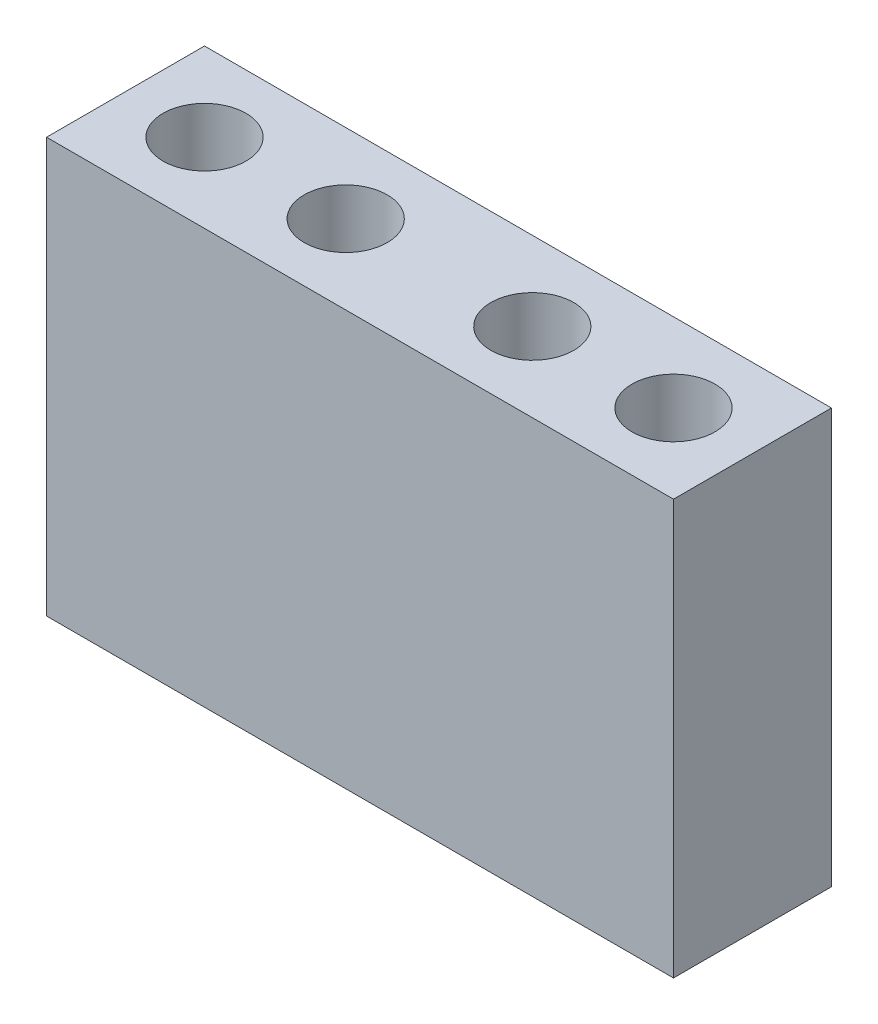
ISO-10303-21;
HEADER;
FILE_DESCRIPTION(('STEP AP214'),'2;1');
FILE_NAME('part.step','',(''),(''),'','','');
FILE_SCHEMA(('AUTOMOTIVE_DESIGN { 1 0 10303 214 1 1 1 1 }'));
ENDSEC;
DATA;
#1=APPLICATION_CONTEXT('core data for automotive mechanical design processes');
#2=APPLICATION_PROTOCOL_DEFINITION('international standard','automotive_design',2000,#1);
#3=PRODUCT_CONTEXT('',#1,'mechanical');
#4=PRODUCT('Part','Part','',(#3));
#5=PRODUCT_RELATED_PRODUCT_CATEGORY('part','',(#4));
#6=PRODUCT_DEFINITION_FORMATION('','',#4);
#7=PRODUCT_DEFINITION_CONTEXT('part definition',#1,'design');
#8=PRODUCT_DEFINITION('design','',#6,#7);
#9=PRODUCT_DEFINITION_SHAPE('','',#8);
#10=(LENGTH_UNIT() NAMED_UNIT(*) SI_UNIT(.MILLI.,.METRE.));
#11=(NAMED_UNIT(*) PLANE_ANGLE_UNIT() SI_UNIT($,.RADIAN.));
#12=(NAMED_UNIT(*) SI_UNIT($,.STERADIAN.) SOLID_ANGLE_UNIT());
#13=UNCERTAINTY_MEASURE_WITH_UNIT(LENGTH_MEASURE(1.E-05),#10,'distance_accuracy_value','');
#14=(GEOMETRIC_REPRESENTATION_CONTEXT(3) GLOBAL_UNCERTAINTY_ASSIGNED_CONTEXT((#13)) GLOBAL_UNIT_ASSIGNED_CONTEXT((#10,
#11,#12)) REPRESENTATION_CONTEXT('',''));
#15=CARTESIAN_POINT('',(0.,0.,0.));
#16=DIRECTION('',(0.,0.,1.));
#17=DIRECTION('',(1.,0.,0.));
#18=AXIS2_PLACEMENT_3D('',#15,#16,#17);
#19=CARTESIAN_POINT('',(-17.9,4.,0.));
#20=DIRECTION('',(1.,0.,0.));
#21=DIRECTION('',(0.,0.,-1.));
#22=AXIS2_PLACEMENT_3D('',#19,#20,#21);
#23=CYLINDRICAL_SURFACE('',#22,2.1);
#24=CARTESIAN_POINT('',(18.6,4.,0.));
#25=DIRECTION('',(1.,0.,0.));
#26=DIRECTION('',(0.,0.,-1.));
#27=AXIS2_PLACEMENT_3D('',#24,#25,#26);
#28=CIRCLE('',#27,2.1);
#29=CARTESIAN_POINT('',(18.6,6.,0.640312423743278));
#30=VERTEX_POINT('',#29);
#31=CARTESIAN_POINT('',(18.6,2.,0.640312423743294));
#32=VERTEX_POINT('',#31);
#33=EDGE_CURVE('E187',#30,#32,#28,.T.);
#34=ORIENTED_EDGE('',*,*,#33,.T.);
#35=CARTESIAN_POINT('',(16.6,4.,0.));
#36=DIRECTION('',(-0.707106781186548,-0.707106781186547,0.));
#37=DIRECTION('',(0.707106781186548,-0.707106781186547,0.));
#38=AXIS2_PLACEMENT_3D('',#35,#36,#37);
#39=ELLIPSE('',#38,2.9698484809835,2.1);
#40=CARTESIAN_POINT('',(16.6,4.,2.1));
#41=VERTEX_POINT('',#40);
#42=EDGE_CURVE('E161',#32,#41,#39,.T.);
#43=ORIENTED_EDGE('',*,*,#42,.T.);
#44=CARTESIAN_POINT('',(16.6,4.,0.));
#45=DIRECTION('',(0.707106781186548,-0.707106781186547,0.));
#46=DIRECTION('',(-0.707106781186548,-0.707106781186547,0.));
#47=AXIS2_PLACEMENT_3D('',#44,#45,#46);
#48=ELLIPSE('',#47,2.9698484809835,2.1);
#49=EDGE_CURVE('E188',#41,#30,#48,.F.);
#50=ORIENTED_EDGE('',*,*,#49,.T.);
#51=EDGE_LOOP('',(#34,#43,#50));
#52=FACE_BOUND('',#51,.T.);
#53=ADVANCED_FACE('F39',(#52),#23,.F.);
#54=CARTESIAN_POINT('',(18.6,2.,-0.640312423743287));
#55=VERTEX_POINT('',#54);
#56=CARTESIAN_POINT('',(18.6,6.,-0.640312423743279));
#57=VERTEX_POINT('',#56);
#58=EDGE_CURVE('E55',#55,#57,#28,.T.);
#59=ORIENTED_EDGE('',*,*,#58,.T.);
#60=CARTESIAN_POINT('',(16.6,4.,-2.1));
#61=VERTEX_POINT('',#60);
#62=EDGE_CURVE('E240',#57,#61,#48,.F.);
#63=ORIENTED_EDGE('',*,*,#62,.T.);
#64=EDGE_CURVE('E171',#61,#55,#39,.T.);
#65=ORIENTED_EDGE('',*,*,#64,.T.);
#66=EDGE_LOOP('',(#59,#63,#65));
#67=FACE_BOUND('',#66,.T.);
#68=ADVANCED_FACE('F451',(#67),#23,.F.);
#69=CARTESIAN_POINT('',(16.6,2.,0.));
#70=DIRECTION('',(0.,-1.,0.));
#71=DIRECTION('',(0.,0.,-1.));
#72=AXIS2_PLACEMENT_3D('',#69,#70,#71);
#73=PLANE('',#72);
#74=DIRECTION('',(0.,0.,1.));
#75=VECTOR('',#74,1.);
#76=CARTESIAN_POINT('',(18.6,2.,0.));
#77=LINE('',#76,#75);
#78=EDGE_CURVE('E178',#55,#32,#77,.T.);
#79=ORIENTED_EDGE('',*,*,#78,.F.);
#80=CARTESIAN_POINT('',(16.6,2.,0.));
#81=DIRECTION('',(0.,-1.,0.));
#82=DIRECTION('',(0.,0.,-1.));
#83=AXIS2_PLACEMENT_3D('',#80,#81,#82);
#84=CIRCLE('',#83,2.1);
#85=CARTESIAN_POINT('',(14.6,2.,-0.640312423743288));
#86=VERTEX_POINT('',#85);
#87=EDGE_CURVE('E185',#86,#55,#84,.T.);
#88=ORIENTED_EDGE('',*,*,#87,.F.);
#89=CARTESIAN_POINT('',(14.6,2.,0.640312423743283));
#90=VERTEX_POINT('',#89);
#91=EDGE_CURVE('E181',#90,#86,#84,.T.);
#92=ORIENTED_EDGE('',*,*,#91,.F.);
#93=EDGE_CURVE('E164',#32,#90,#84,.T.);
#94=ORIENTED_EDGE('',*,*,#93,.F.);
#95=EDGE_LOOP('',(#79,#88,#92,#94));
#96=FACE_BOUND('',#95,.T.);
#97=ADVANCED_FACE('F176',(#96),#73,.F.);
#98=CARTESIAN_POINT('',(16.6,21.,0.));
#99=DIRECTION('',(0.,-1.,0.));
#100=DIRECTION('',(0.,0.,-1.));
#101=AXIS2_PLACEMENT_3D('',#98,#99,#100);
#102=CYLINDRICAL_SURFACE('',#101,2.1);
#103=ORIENTED_EDGE('',*,*,#42,.F.);
#104=ORIENTED_EDGE('',*,*,#93,.T.);
#105=CARTESIAN_POINT('',(16.6,4.,0.));
#106=DIRECTION('',(0.707106781186548,-0.707106781186547,0.));
#107=DIRECTION('',(-0.707106781186548,-0.707106781186547,0.));
#108=AXIS2_PLACEMENT_3D('',#105,#106,#107);
#109=ELLIPSE('',#108,2.9698484809835,2.1);
#110=EDGE_CURVE('E166',#41,#90,#109,.T.);
#111=ORIENTED_EDGE('',*,*,#110,.F.);
#112=EDGE_LOOP('',(#103,#104,#111));
#113=FACE_BOUND('',#112,.T.);
#114=ADVANCED_FACE('F163',(#113),#102,.F.);
#115=EDGE_CURVE('E237',#86,#61,#109,.T.);
#116=ORIENTED_EDGE('',*,*,#115,.F.);
#117=ORIENTED_EDGE('',*,*,#87,.T.);
#118=ORIENTED_EDGE('',*,*,#64,.F.);
#119=EDGE_LOOP('',(#116,#117,#118));
#120=FACE_BOUND('',#119,.T.);
#121=ADVANCED_FACE('F511',(#120),#102,.F.);
#122=CARTESIAN_POINT('',(9.45,21.,0.));
#123=DIRECTION('',(0.,-1.,0.));
#124=DIRECTION('',(0.,0.,-1.));
#125=AXIS2_PLACEMENT_3D('',#122,#123,#124);
#126=CYLINDRICAL_SURFACE('',#125,2.1);
#127=CARTESIAN_POINT('',(9.45,4.,0.));
#128=DIRECTION('',(-0.707106781186548,-0.707106781186547,0.));
#129=DIRECTION('',(0.707106781186548,-0.707106781186547,0.));
#130=AXIS2_PLACEMENT_3D('',#127,#128,#129);
#131=ELLIPSE('',#130,2.9698484809835,2.1);
#132=CARTESIAN_POINT('',(11.45,2.,0.640312423743282));
#133=VERTEX_POINT('',#132);
#134=CARTESIAN_POINT('',(9.45,4.,2.1));
#135=VERTEX_POINT('',#134);
#136=EDGE_CURVE('E347',#133,#135,#131,.T.);
#137=ORIENTED_EDGE('',*,*,#136,.F.);
#138=CARTESIAN_POINT('',(9.45,2.,0.));
#139=DIRECTION('',(0.,-1.,0.));
#140=DIRECTION('',(0.,0.,-1.));
#141=AXIS2_PLACEMENT_3D('',#138,#139,#140);
#142=CIRCLE('',#141,2.1);
#143=CARTESIAN_POINT('',(7.45,2.,0.64031242374328));
#144=VERTEX_POINT('',#143);
#145=EDGE_CURVE('E211',#133,#144,#142,.T.);
#146=ORIENTED_EDGE('',*,*,#145,.T.);
#147=CARTESIAN_POINT('',(9.45,4.,0.));
#148=DIRECTION('',(0.707106781186548,-0.707106781186547,0.));
#149=DIRECTION('',(-0.707106781186548,-0.707106781186547,0.));
#150=AXIS2_PLACEMENT_3D('',#147,#148,#149);
#151=ELLIPSE('',#150,2.9698484809835,2.1);
#152=EDGE_CURVE('E48',#135,#144,#151,.T.);
#153=ORIENTED_EDGE('',*,*,#152,.F.);
#154=EDGE_LOOP('',(#137,#146,#153));
#155=FACE_BOUND('',#154,.T.);
#156=ADVANCED_FACE('F385',(#155),#126,.F.);
#157=CARTESIAN_POINT('',(7.45,2.,-0.640312423743292));
#158=VERTEX_POINT('',#157);
#159=CARTESIAN_POINT('',(9.45,4.,-2.1));
#160=VERTEX_POINT('',#159);
#161=EDGE_CURVE('E351',#158,#160,#151,.T.);
#162=ORIENTED_EDGE('',*,*,#161,.F.);
#163=CARTESIAN_POINT('',(11.45,2.,-0.64031242374329));
#164=VERTEX_POINT('',#163);
#165=EDGE_CURVE('E206',#158,#164,#142,.T.);
#166=ORIENTED_EDGE('',*,*,#165,.T.);
#167=EDGE_CURVE('E348',#160,#164,#131,.T.);
#168=ORIENTED_EDGE('',*,*,#167,.F.);
#169=EDGE_LOOP('',(#162,#166,#168));
#170=FACE_BOUND('',#169,.T.);
#171=ADVANCED_FACE('F372',(#170),#126,.F.);
#172=CARTESIAN_POINT('',(0.,21.,0.));
#173=DIRECTION('',(0.,-1.,0.));
#174=DIRECTION('',(0.,0.,-1.));
#175=AXIS2_PLACEMENT_3D('',#172,#173,#174);
#176=CYLINDRICAL_SURFACE('',#175,2.1);
#177=CARTESIAN_POINT('',(0.,4.,0.));
#178=DIRECTION('',(-0.707106781186548,-0.707106781186547,0.));
#179=DIRECTION('',(0.707106781186548,-0.707106781186547,0.));
#180=AXIS2_PLACEMENT_3D('',#177,#178,#179);
#181=ELLIPSE('',#180,2.9698484809835,2.1);
#182=CARTESIAN_POINT('',(2.,2.,0.640312423743278));
#183=VERTEX_POINT('',#182);
#184=CARTESIAN_POINT('',(0.,4.,2.1));
#185=VERTEX_POINT('',#184);
#186=EDGE_CURVE('E266',#183,#185,#181,.T.);
#187=ORIENTED_EDGE('',*,*,#186,.F.);
#188=CARTESIAN_POINT('',(0.,2.,0.));
#189=DIRECTION('',(0.,-1.,0.));
#190=DIRECTION('',(0.,0.,-1.));
#191=AXIS2_PLACEMENT_3D('',#188,#189,#190);
#192=CIRCLE('',#191,2.1);
#193=CARTESIAN_POINT('',(-2.,2.,0.640312423743276));
#194=VERTEX_POINT('',#193);
#195=EDGE_CURVE('E221',#183,#194,#192,.T.);
#196=ORIENTED_EDGE('',*,*,#195,.T.);
#197=CARTESIAN_POINT('',(0.,4.,0.));
#198=DIRECTION('',(0.707106781186548,-0.707106781186547,0.));
#199=DIRECTION('',(-0.707106781186548,-0.707106781186547,0.));
#200=AXIS2_PLACEMENT_3D('',#197,#198,#199);
#201=ELLIPSE('',#200,2.9698484809835,2.1);
#202=EDGE_CURVE('E272',#185,#194,#201,.T.);
#203=ORIENTED_EDGE('',*,*,#202,.F.);
#204=EDGE_LOOP('',(#187,#196,#203));
#205=FACE_BOUND('',#204,.T.);
#206=ADVANCED_FACE('F432',(#205),#176,.F.);
#207=CARTESIAN_POINT('',(-2.,2.,-0.640312423743296));
#208=VERTEX_POINT('',#207);
#209=CARTESIAN_POINT('',(0.,4.,-2.1));
#210=VERTEX_POINT('',#209);
#211=EDGE_CURVE('E271',#208,#210,#201,.T.);
#212=ORIENTED_EDGE('',*,*,#211,.F.);
#213=CARTESIAN_POINT('',(2.,2.,-0.640312423743294));
#214=VERTEX_POINT('',#213);
#215=EDGE_CURVE('E215',#208,#214,#192,.T.);
#216=ORIENTED_EDGE('',*,*,#215,.T.);
#217=EDGE_CURVE('E267',#210,#214,#181,.T.);
#218=ORIENTED_EDGE('',*,*,#217,.F.);
#219=EDGE_LOOP('',(#212,#216,#218));
#220=FACE_BOUND('',#219,.T.);
#221=ADVANCED_FACE('F419',(#220),#176,.F.);
#222=CARTESIAN_POINT('',(-7.15,21.,0.));
#223=DIRECTION('',(0.,-1.,0.));
#224=DIRECTION('',(0.,0.,-1.));
#225=AXIS2_PLACEMENT_3D('',#222,#223,#224);
#226=CYLINDRICAL_SURFACE('',#225,2.1);
#227=CARTESIAN_POINT('',(-7.15,4.,0.));
#228=DIRECTION('',(-0.707106781186548,-0.707106781186547,0.));
#229=DIRECTION('',(0.707106781186548,-0.707106781186547,0.));
#230=AXIS2_PLACEMENT_3D('',#227,#228,#229);
#231=ELLIPSE('',#230,2.9698484809835,2.1);
#232=CARTESIAN_POINT('',(-5.15,2.,0.640312423743275));
#233=VERTEX_POINT('',#232);
#234=CARTESIAN_POINT('',(-7.15,4.,2.09999999999999));
#235=VERTEX_POINT('',#234);
#236=EDGE_CURVE('E247',#233,#235,#231,.T.);
#237=ORIENTED_EDGE('',*,*,#236,.F.);
#238=CARTESIAN_POINT('',(-7.15,2.,0.));
#239=DIRECTION('',(0.,-1.,0.));
#240=DIRECTION('',(0.,0.,-1.));
#241=AXIS2_PLACEMENT_3D('',#238,#239,#240);
#242=CIRCLE('',#241,2.1);
#243=CARTESIAN_POINT('',(-9.15000000000001,2.,0.640312423743273));
#244=VERTEX_POINT('',#243);
#245=EDGE_CURVE('E230',#233,#244,#242,.T.);
#246=ORIENTED_EDGE('',*,*,#245,.T.);
#247=CARTESIAN_POINT('',(-7.15,4.,0.));
#248=DIRECTION('',(0.707106781186548,-0.707106781186547,0.));
#249=DIRECTION('',(-0.707106781186548,-0.707106781186547,0.));
#250=AXIS2_PLACEMENT_3D('',#247,#248,#249);
#251=ELLIPSE('',#250,2.9698484809835,2.1);
#252=EDGE_CURVE('E254',#235,#244,#251,.T.);
#253=ORIENTED_EDGE('',*,*,#252,.F.);
#254=EDGE_LOOP('',(#237,#246,#253));
#255=FACE_BOUND('',#254,.T.);
#256=ADVANCED_FACE('F521',(#255),#226,.F.);
#257=CARTESIAN_POINT('',(-9.15,2.,-0.640312423743299));
#258=VERTEX_POINT('',#257);
#259=CARTESIAN_POINT('',(-7.15,4.,-2.10000000000001));
#260=VERTEX_POINT('',#259);
#261=EDGE_CURVE('E252',#258,#260,#251,.T.);
#262=ORIENTED_EDGE('',*,*,#261,.F.);
#263=CARTESIAN_POINT('',(-5.15,2.,-0.640312423743297));
#264=VERTEX_POINT('',#263);
#265=EDGE_CURVE('E225',#258,#264,#242,.T.);
#266=ORIENTED_EDGE('',*,*,#265,.T.);
#267=EDGE_CURVE('E248',#260,#264,#231,.T.);
#268=ORIENTED_EDGE('',*,*,#267,.F.);
#269=EDGE_LOOP('',(#262,#266,#268));
#270=FACE_BOUND('',#269,.T.);
#271=ADVANCED_FACE('F524',(#270),#226,.F.);
#272=CARTESIAN_POINT('',(0.,4.,0.));
#273=DIRECTION('',(0.707106781186548,-0.707106781186547,0.));
#274=DIRECTION('',(-0.707106781186548,-0.707106781186547,0.));
#275=AXIS2_PLACEMENT_3D('',#272,#273,#274);
#276=ELLIPSE('',#275,2.9698484809835,2.1);
#277=EDGE_CURVE('E276',#185,#210,#276,.F.);
#278=ORIENTED_EDGE('',*,*,#277,.F.);
#279=CARTESIAN_POINT('',(0.,4.,0.));
#280=DIRECTION('',(-0.707106781186548,-0.707106781186547,0.));
#281=DIRECTION('',(0.707106781186548,-0.707106781186547,0.));
#282=AXIS2_PLACEMENT_3D('',#279,#280,#281);
#283=ELLIPSE('',#282,2.9698484809835,2.1);
#284=EDGE_CURVE('E262',#210,#185,#283,.F.);
#285=ORIENTED_EDGE('',*,*,#284,.F.);
#286=EDGE_LOOP('',(#278,#285));
#287=FACE_BOUND('',#286,.T.);
#288=CARTESIAN_POINT('',(0.,21.,0.));
#289=DIRECTION('',(0.,1.,0.));
#290=DIRECTION('',(0.,0.,1.));
#291=AXIS2_PLACEMENT_3D('',#288,#289,#290);
#292=CIRCLE('',#291,2.1);
#293=CARTESIAN_POINT('',(0.,21.,2.1));
#294=VERTEX_POINT('',#293);
#295=EDGE_CURVE('E297',#294,#294,#292,.T.);
#296=ORIENTED_EDGE('',*,*,#295,.T.);
#297=EDGE_LOOP('',(#296));
#298=FACE_BOUND('',#297,.T.);
#299=ADVANCED_FACE('F429',(#287,#298),#176,.F.);
#300=CARTESIAN_POINT('',(-7.15,4.,0.));
#301=DIRECTION('',(0.707106781186548,-0.707106781186547,0.));
#302=DIRECTION('',(-0.707106781186548,-0.707106781186547,0.));
#303=AXIS2_PLACEMENT_3D('',#300,#301,#302);
#304=ELLIPSE('',#303,2.9698484809835,2.1);
#305=EDGE_CURVE('E258',#235,#260,#304,.F.);
#306=ORIENTED_EDGE('',*,*,#305,.F.);
#307=CARTESIAN_POINT('',(-7.15,4.,0.));
#308=DIRECTION('',(-0.707106781186548,-0.707106781186547,0.));
#309=DIRECTION('',(0.707106781186548,-0.707106781186547,0.));
#310=AXIS2_PLACEMENT_3D('',#307,#308,#309);
#311=ELLIPSE('',#310,2.9698484809835,2.1);
#312=EDGE_CURVE('E243',#260,#235,#311,.F.);
#313=ORIENTED_EDGE('',*,*,#312,.F.);
#314=EDGE_LOOP('',(#306,#313));
#315=FACE_BOUND('',#314,.T.);
#316=CARTESIAN_POINT('',(-7.15,21.,0.));
#317=DIRECTION('',(0.,1.,0.));
#318=DIRECTION('',(0.,0.,1.));
#319=AXIS2_PLACEMENT_3D('',#316,#317,#318);
#320=CIRCLE('',#319,2.1);
#321=CARTESIAN_POINT('',(-7.15,21.,2.1));
#322=VERTEX_POINT('',#321);
#323=EDGE_CURVE('E293',#322,#322,#320,.T.);
#324=ORIENTED_EDGE('',*,*,#323,.T.);
#325=EDGE_LOOP('',(#324));
#326=FACE_BOUND('',#325,.T.);
#327=ADVANCED_FACE('F509',(#315,#326),#226,.F.);
#328=ORIENTED_EDGE('',*,*,#49,.F.);
#329=CARTESIAN_POINT('',(16.6,4.,0.));
#330=DIRECTION('',(-0.707106781186548,-0.707106781186547,0.));
#331=DIRECTION('',(0.707106781186548,-0.707106781186547,0.));
#332=AXIS2_PLACEMENT_3D('',#329,#330,#331);
#333=ELLIPSE('',#332,2.9698484809835,2.1);
#334=EDGE_CURVE('E172',#61,#41,#333,.F.);
#335=ORIENTED_EDGE('',*,*,#334,.F.);
#336=ORIENTED_EDGE('',*,*,#62,.F.);
#337=CARTESIAN_POINT('',(16.6,4.,0.));
#338=DIRECTION('',(0.707106781186548,-0.707106781186547,0.));
#339=DIRECTION('',(-0.707106781186548,-0.707106781186547,0.));
#340=AXIS2_PLACEMENT_3D('',#337,#338,#339);
#341=ELLIPSE('',#340,2.9698484809835,2.1);
#342=EDGE_CURVE('E62',#30,#57,#341,.F.);
#343=ORIENTED_EDGE('',*,*,#342,.F.);
#344=EDGE_LOOP('',(#328,#335,#336,#343));
#345=FACE_BOUND('',#344,.T.);
#346=CARTESIAN_POINT('',(16.6,21.,0.));
#347=DIRECTION('',(0.,1.,0.));
#348=DIRECTION('',(0.,0.,1.));
#349=AXIS2_PLACEMENT_3D('',#346,#347,#348);
#350=CIRCLE('',#349,2.1);
#351=CARTESIAN_POINT('',(16.6,21.,2.1));
#352=VERTEX_POINT('',#351);
#353=EDGE_CURVE('E289',#352,#352,#350,.T.);
#354=ORIENTED_EDGE('',*,*,#353,.T.);
#355=EDGE_LOOP('',(#354));
#356=FACE_BOUND('',#355,.T.);
#357=ADVANCED_FACE('F505',(#345,#356),#102,.F.);
#358=CARTESIAN_POINT('',(9.45,4.,0.));
#359=DIRECTION('',(0.707106781186548,-0.707106781186547,0.));
#360=DIRECTION('',(-0.707106781186548,-0.707106781186547,0.));
#361=AXIS2_PLACEMENT_3D('',#358,#359,#360);
#362=ELLIPSE('',#361,2.9698484809835,2.1);
#363=EDGE_CURVE('E11',#135,#160,#362,.F.);
#364=ORIENTED_EDGE('',*,*,#363,.F.);
#365=CARTESIAN_POINT('',(9.45,4.,0.));
#366=DIRECTION('',(-0.707106781186548,-0.707106781186547,0.));
#367=DIRECTION('',(0.707106781186548,-0.707106781186547,0.));
#368=AXIS2_PLACEMENT_3D('',#365,#366,#367);
#369=ELLIPSE('',#368,2.9698484809835,2.1);
#370=EDGE_CURVE('E343',#160,#135,#369,.F.);
#371=ORIENTED_EDGE('',*,*,#370,.F.);
#372=EDGE_LOOP('',(#364,#371));
#373=FACE_BOUND('',#372,.T.);
#374=CARTESIAN_POINT('',(9.45,21.,0.));
#375=DIRECTION('',(0.,1.,0.));
#376=DIRECTION('',(0.,0.,1.));
#377=AXIS2_PLACEMENT_3D('',#374,#375,#376);
#378=CIRCLE('',#377,2.1);
#379=CARTESIAN_POINT('',(9.45,21.,2.1));
#380=VERTEX_POINT('',#379);
#381=EDGE_CURVE('E285',#380,#380,#378,.T.);
#382=ORIENTED_EDGE('',*,*,#381,.T.);
#383=EDGE_LOOP('',(#382));
#384=FACE_BOUND('',#383,.T.);
#385=ADVANCED_FACE('F366',(#373,#384),#126,.F.);
#386=CARTESIAN_POINT('',(0.,21.,0.));
#387=DIRECTION('',(0.,1.,0.));
#388=DIRECTION('',(0.,0.,1.));
#389=AXIS2_PLACEMENT_3D('',#386,#387,#388);
#390=PLANE('',#389);
#391=ORIENTED_EDGE('',*,*,#353,.F.);
#392=EDGE_LOOP('',(#391));
#393=FACE_BOUND('',#392,.T.);
#394=ORIENTED_EDGE('',*,*,#295,.F.);
#395=EDGE_LOOP('',(#394));
#396=FACE_BOUND('',#395,.T.);
#397=DIRECTION('',(0.,0.,1.));
#398=VECTOR('',#397,1.);
#399=CARTESIAN_POINT('',(-11.15,21.,-4.));
#400=LINE('',#399,#398);
#401=CARTESIAN_POINT('',(-11.15,21.,-4.));
#402=VERTEX_POINT('',#401);
#403=CARTESIAN_POINT('',(-11.15,21.,4.));
#404=VERTEX_POINT('',#403);
#405=EDGE_CURVE('E302',#402,#404,#400,.T.);
#406=ORIENTED_EDGE('',*,*,#405,.T.);
#407=DIRECTION('',(1.,0.,0.));
#408=VECTOR('',#407,1.);
#409=CARTESIAN_POINT('',(-11.15,21.,4.));
#410=LINE('',#409,#408);
#411=CARTESIAN_POINT('',(20.6,21.,4.));
#412=VERTEX_POINT('',#411);
#413=EDGE_CURVE('E306',#404,#412,#410,.T.);
#414=ORIENTED_EDGE('',*,*,#413,.T.);
#415=DIRECTION('',(0.,0.,-1.));
#416=VECTOR('',#415,1.);
#417=CARTESIAN_POINT('',(20.6,21.,-4.));
#418=LINE('',#417,#416);
#419=CARTESIAN_POINT('',(20.6,21.,-4.));
#420=VERTEX_POINT('',#419);
#421=EDGE_CURVE('E310',#412,#420,#418,.T.);
#422=ORIENTED_EDGE('',*,*,#421,.T.);
#423=DIRECTION('',(-1.,0.,0.));
#424=VECTOR('',#423,1.);
#425=CARTESIAN_POINT('',(-11.15,21.,-4.));
#426=LINE('',#425,#424);
#427=EDGE_CURVE('E313',#420,#402,#426,.T.);
#428=ORIENTED_EDGE('',*,*,#427,.T.);
#429=EDGE_LOOP('',(#406,#414,#422,#428));
#430=FACE_BOUND('',#429,.T.);
#431=ORIENTED_EDGE('',*,*,#323,.F.);
#432=EDGE_LOOP('',(#431));
#433=FACE_BOUND('',#432,.T.);
#434=ORIENTED_EDGE('',*,*,#381,.F.);
#435=EDGE_LOOP('',(#434));
#436=FACE_BOUND('',#435,.T.);
#437=ADVANCED_FACE('F497',(#393,#396,#430,#433,#436),#390,.T.);
#438=CARTESIAN_POINT('',(0.,0.,0.));
#439=DIRECTION('',(0.,1.,0.));
#440=DIRECTION('',(0.,0.,1.));
#441=AXIS2_PLACEMENT_3D('',#438,#439,#440);
#442=PLANE('',#441);
#443=DIRECTION('',(0.,0.,1.));
#444=VECTOR('',#443,1.);
#445=CARTESIAN_POINT('',(-11.15,0.,-4.));
#446=LINE('',#445,#444);
#447=CARTESIAN_POINT('',(-11.15,0.,-4.));
#448=VERTEX_POINT('',#447);
#449=CARTESIAN_POINT('',(-11.15,0.,4.));
#450=VERTEX_POINT('',#449);
#451=EDGE_CURVE('E301',#448,#450,#446,.T.);
#452=ORIENTED_EDGE('',*,*,#451,.F.);
#453=DIRECTION('',(-1.,0.,0.));
#454=VECTOR('',#453,1.);
#455=CARTESIAN_POINT('',(-11.15,0.,-4.));
#456=LINE('',#455,#454);
#457=CARTESIAN_POINT('',(20.6,0.,-4.));
#458=VERTEX_POINT('',#457);
#459=EDGE_CURVE('E307',#458,#448,#456,.T.);
#460=ORIENTED_EDGE('',*,*,#459,.F.);
#461=DIRECTION('',(0.,0.,-1.));
#462=VECTOR('',#461,1.);
#463=CARTESIAN_POINT('',(20.6,0.,-4.));
#464=LINE('',#463,#462);
#465=CARTESIAN_POINT('',(20.6,0.,4.));
#466=VERTEX_POINT('',#465);
#467=EDGE_CURVE('E323',#466,#458,#464,.T.);
#468=ORIENTED_EDGE('',*,*,#467,.F.);
#469=DIRECTION('',(1.,0.,0.));
#470=VECTOR('',#469,1.);
#471=CARTESIAN_POINT('',(-11.15,0.,4.));
#472=LINE('',#471,#470);
#473=EDGE_CURVE('E320',#450,#466,#472,.T.);
#474=ORIENTED_EDGE('',*,*,#473,.F.);
#475=EDGE_LOOP('',(#452,#460,#468,#474));
#476=FACE_BOUND('',#475,.T.);
#477=ADVANCED_FACE('F476',(#476),#442,.F.);
#478=CARTESIAN_POINT('',(-11.15,21.,-4.));
#479=DIRECTION('',(1.,0.,0.));
#480=DIRECTION('',(0.,0.,-1.));
#481=AXIS2_PLACEMENT_3D('',#478,#479,#480);
#482=PLANE('',#481);
#483=CARTESIAN_POINT('',(-11.15,4.,0.));
#484=DIRECTION('',(1.,0.,0.));
#485=DIRECTION('',(0.,0.,-1.));
#486=AXIS2_PLACEMENT_3D('',#483,#484,#485);
#487=CIRCLE('',#486,2.1);
#488=CARTESIAN_POINT('',(-11.15,4.,-2.10000000000001));
#489=VERTEX_POINT('',#488);
#490=EDGE_CURVE('E281',#489,#489,#487,.T.);
#491=ORIENTED_EDGE('',*,*,#490,.T.);
#492=EDGE_LOOP('',(#491));
#493=FACE_BOUND('',#492,.T.);
#494=ORIENTED_EDGE('',*,*,#451,.T.);
#495=DIRECTION('',(0.,-1.,0.));
#496=VECTOR('',#495,1.);
#497=CARTESIAN_POINT('',(-11.15,21.,4.));
#498=LINE('',#497,#496);
#499=EDGE_CURVE('E339',#404,#450,#498,.T.);
#500=ORIENTED_EDGE('',*,*,#499,.F.);
#501=ORIENTED_EDGE('',*,*,#405,.F.);
#502=DIRECTION('',(0.,-1.,0.));
#503=VECTOR('',#502,1.);
#504=CARTESIAN_POINT('',(-11.15,21.,-4.));
#505=LINE('',#504,#503);
#506=EDGE_CURVE('E316',#402,#448,#505,.T.);
#507=ORIENTED_EDGE('',*,*,#506,.T.);
#508=EDGE_LOOP('',(#494,#500,#501,#507));
#509=FACE_BOUND('',#508,.T.);
#510=ADVANCED_FACE('F41',(#493,#509),#482,.F.);
#511=CARTESIAN_POINT('',(-11.15,21.,4.));
#512=DIRECTION('',(0.,0.,-1.));
#513=DIRECTION('',(-1.,0.,0.));
#514=AXIS2_PLACEMENT_3D('',#511,#512,#513);
#515=PLANE('',#514);
#516=ORIENTED_EDGE('',*,*,#473,.T.);
#517=DIRECTION('',(0.,-1.,0.));
#518=VECTOR('',#517,1.);
#519=CARTESIAN_POINT('',(20.6,21.,4.));
#520=LINE('',#519,#518);
#521=EDGE_CURVE('E335',#412,#466,#520,.T.);
#522=ORIENTED_EDGE('',*,*,#521,.F.);
#523=ORIENTED_EDGE('',*,*,#413,.F.);
#524=ORIENTED_EDGE('',*,*,#499,.T.);
#525=EDGE_LOOP('',(#516,#522,#523,#524));
#526=FACE_BOUND('',#525,.T.);
#527=ADVANCED_FACE('F472',(#526),#515,.F.);
#528=CARTESIAN_POINT('',(20.6,21.,-4.));
#529=DIRECTION('',(-1.,0.,0.));
#530=DIRECTION('',(0.,0.,1.));
#531=AXIS2_PLACEMENT_3D('',#528,#529,#530);
#532=PLANE('',#531);
#533=ORIENTED_EDGE('',*,*,#467,.T.);
#534=DIRECTION('',(0.,-1.,0.));
#535=VECTOR('',#534,1.);
#536=CARTESIAN_POINT('',(20.6,21.,-4.));
#537=LINE('',#536,#535);
#538=EDGE_CURVE('E331',#420,#458,#537,.T.);
#539=ORIENTED_EDGE('',*,*,#538,.F.);
#540=ORIENTED_EDGE('',*,*,#421,.F.);
#541=ORIENTED_EDGE('',*,*,#521,.T.);
#542=EDGE_LOOP('',(#533,#539,#540,#541));
#543=FACE_BOUND('',#542,.T.);
#544=ADVANCED_FACE('F466',(#543),#532,.F.);
#545=CARTESIAN_POINT('',(-11.15,21.,-4.));
#546=DIRECTION('',(0.,0.,1.));
#547=DIRECTION('',(1.,0.,0.));
#548=AXIS2_PLACEMENT_3D('',#545,#546,#547);
#549=PLANE('',#548);
#550=ORIENTED_EDGE('',*,*,#459,.T.);
#551=ORIENTED_EDGE('',*,*,#506,.F.);
#552=ORIENTED_EDGE('',*,*,#427,.F.);
#553=ORIENTED_EDGE('',*,*,#538,.T.);
#554=EDGE_LOOP('',(#550,#551,#552,#553));
#555=FACE_BOUND('',#554,.T.);
#556=ADVANCED_FACE('F460',(#555),#549,.F.);
#557=ORIENTED_EDGE('',*,*,#277,.T.);
#558=ORIENTED_EDGE('',*,*,#217,.T.);
#559=CARTESIAN_POINT('',(0.,4.,0.));
#560=DIRECTION('',(0.707106781186547,0.707106781186547,0.));
#561=DIRECTION('',(0.707106781186547,-0.707106781186547,0.));
#562=AXIS2_PLACEMENT_3D('',#559,#560,#561);
#563=ELLIPSE('',#562,2.9698484809835,2.1);
#564=EDGE_CURVE('E220',#214,#183,#563,.F.);
#565=ORIENTED_EDGE('',*,*,#564,.T.);
#566=ORIENTED_EDGE('',*,*,#186,.T.);
#567=EDGE_LOOP('',(#557,#558,#565,#566));
#568=FACE_BOUND('',#567,.T.);
#569=ORIENTED_EDGE('',*,*,#152,.T.);
#570=CARTESIAN_POINT('',(9.45,4.,0.));
#571=DIRECTION('',(0.707106781186547,-0.707106781186547,0.));
#572=DIRECTION('',(0.707106781186547,0.707106781186547,0.));
#573=AXIS2_PLACEMENT_3D('',#570,#571,#572);
#574=ELLIPSE('',#573,2.9698484809835,2.1);
#575=EDGE_CURVE('E210',#144,#158,#574,.T.);
#576=ORIENTED_EDGE('',*,*,#575,.T.);
#577=ORIENTED_EDGE('',*,*,#161,.T.);
#578=ORIENTED_EDGE('',*,*,#370,.T.);
#579=EDGE_LOOP('',(#569,#576,#577,#578));
#580=FACE_BOUND('',#579,.T.);
#581=ADVANCED_FACE('F360',(#568,#580),#23,.F.);
#582=ORIENTED_EDGE('',*,*,#110,.T.);
#583=CARTESIAN_POINT('',(16.6,4.,0.));
#584=DIRECTION('',(0.707106781186547,-0.707106781186547,0.));
#585=DIRECTION('',(0.707106781186547,0.707106781186547,0.));
#586=AXIS2_PLACEMENT_3D('',#583,#584,#585);
#587=ELLIPSE('',#586,2.9698484809835,2.1);
#588=EDGE_CURVE('E183',#90,#86,#587,.T.);
#589=ORIENTED_EDGE('',*,*,#588,.T.);
#590=ORIENTED_EDGE('',*,*,#115,.T.);
#591=ORIENTED_EDGE('',*,*,#334,.T.);
#592=EDGE_LOOP('',(#582,#589,#590,#591));
#593=FACE_BOUND('',#592,.T.);
#594=ORIENTED_EDGE('',*,*,#363,.T.);
#595=ORIENTED_EDGE('',*,*,#167,.T.);
#596=EDGE_CURVE('E352',#164,#133,#131,.T.);
#597=ORIENTED_EDGE('',*,*,#596,.T.);
#598=ORIENTED_EDGE('',*,*,#136,.T.);
#599=EDGE_LOOP('',(#594,#595,#597,#598));
#600=FACE_BOUND('',#599,.T.);
#601=ADVANCED_FACE('F369',(#593,#600),#23,.F.);
#602=ORIENTED_EDGE('',*,*,#252,.T.);
#603=CARTESIAN_POINT('',(-7.15,4.,0.));
#604=DIRECTION('',(0.707106781186547,-0.707106781186547,0.));
#605=DIRECTION('',(0.707106781186547,0.707106781186547,0.));
#606=AXIS2_PLACEMENT_3D('',#603,#604,#605);
#607=ELLIPSE('',#606,2.9698484809835,2.1);
#608=EDGE_CURVE('E229',#244,#258,#607,.T.);
#609=ORIENTED_EDGE('',*,*,#608,.T.);
#610=ORIENTED_EDGE('',*,*,#261,.T.);
#611=ORIENTED_EDGE('',*,*,#312,.T.);
#612=EDGE_LOOP('',(#602,#609,#610,#611));
#613=FACE_BOUND('',#612,.T.);
#614=ORIENTED_EDGE('',*,*,#490,.F.);
#615=EDGE_LOOP('',(#614));
#616=FACE_BOUND('',#615,.T.);
#617=ADVANCED_FACE('F456',(#613,#616),#23,.F.);
#618=ORIENTED_EDGE('',*,*,#202,.T.);
#619=EDGE_CURVE('E277',#194,#208,#201,.T.);
#620=ORIENTED_EDGE('',*,*,#619,.T.);
#621=ORIENTED_EDGE('',*,*,#211,.T.);
#622=ORIENTED_EDGE('',*,*,#284,.T.);
#623=EDGE_LOOP('',(#618,#620,#621,#622));
#624=FACE_BOUND('',#623,.T.);
#625=ORIENTED_EDGE('',*,*,#305,.T.);
#626=ORIENTED_EDGE('',*,*,#267,.T.);
#627=EDGE_CURVE('E253',#264,#233,#231,.T.);
#628=ORIENTED_EDGE('',*,*,#627,.T.);
#629=ORIENTED_EDGE('',*,*,#236,.T.);
#630=EDGE_LOOP('',(#625,#626,#628,#629));
#631=FACE_BOUND('',#630,.T.);
#632=ADVANCED_FACE('F434',(#624,#631),#23,.F.);
#633=CARTESIAN_POINT('',(-7.15,2.,0.));
#634=DIRECTION('',(0.,-1.,0.));
#635=DIRECTION('',(0.,0.,-1.));
#636=AXIS2_PLACEMENT_3D('',#633,#634,#635);
#637=PLANE('',#636);
#638=EDGE_CURVE('E226',#264,#233,#242,.T.);
#639=ORIENTED_EDGE('',*,*,#638,.F.);
#640=ORIENTED_EDGE('',*,*,#265,.F.);
#641=EDGE_CURVE('E405',#244,#258,#242,.T.);
#642=ORIENTED_EDGE('',*,*,#641,.F.);
#643=ORIENTED_EDGE('',*,*,#245,.F.);
#644=EDGE_LOOP('',(#639,#640,#642,#643));
#645=FACE_BOUND('',#644,.T.);
#646=ADVANCED_FACE('F565',(#645),#637,.F.);
#647=CARTESIAN_POINT('',(-7.15,2.,0.));
#648=DIRECTION('',(0.,-1.,0.));
#649=DIRECTION('',(0.,0.,-1.));
#650=AXIS2_PLACEMENT_3D('',#647,#648,#649);
#651=CYLINDRICAL_SURFACE('',#650,2.1);
#652=ORIENTED_EDGE('',*,*,#627,.F.);
#653=ORIENTED_EDGE('',*,*,#638,.T.);
#654=EDGE_LOOP('',(#652,#653));
#655=FACE_BOUND('',#654,.T.);
#656=ADVANCED_FACE('F560',(#655),#651,.T.);
#657=ORIENTED_EDGE('',*,*,#608,.F.);
#658=ORIENTED_EDGE('',*,*,#641,.T.);
#659=EDGE_LOOP('',(#657,#658));
#660=FACE_BOUND('',#659,.T.);
#661=ADVANCED_FACE('F556',(#660),#651,.T.);
#662=CARTESIAN_POINT('',(0.,2.,0.));
#663=DIRECTION('',(0.,-1.,0.));
#664=DIRECTION('',(0.,0.,-1.));
#665=AXIS2_PLACEMENT_3D('',#662,#663,#664);
#666=PLANE('',#665);
#667=EDGE_CURVE('E216',#214,#183,#192,.T.);
#668=ORIENTED_EDGE('',*,*,#667,.F.);
#669=ORIENTED_EDGE('',*,*,#215,.F.);
#670=EDGE_CURVE('E412',#194,#208,#192,.T.);
#671=ORIENTED_EDGE('',*,*,#670,.F.);
#672=ORIENTED_EDGE('',*,*,#195,.F.);
#673=EDGE_LOOP('',(#668,#669,#671,#672));
#674=FACE_BOUND('',#673,.T.);
#675=ADVANCED_FACE('F438',(#674),#666,.F.);
#676=CARTESIAN_POINT('',(0.,2.,0.));
#677=DIRECTION('',(0.,-1.,0.));
#678=DIRECTION('',(0.,0.,-1.));
#679=AXIS2_PLACEMENT_3D('',#676,#677,#678);
#680=CYLINDRICAL_SURFACE('',#679,2.1);
#681=ORIENTED_EDGE('',*,*,#619,.F.);
#682=ORIENTED_EDGE('',*,*,#670,.T.);
#683=EDGE_LOOP('',(#681,#682));
#684=FACE_BOUND('',#683,.T.);
#685=ADVANCED_FACE('F437',(#684),#680,.T.);
#686=ORIENTED_EDGE('',*,*,#564,.F.);
#687=ORIENTED_EDGE('',*,*,#667,.T.);
#688=EDGE_LOOP('',(#686,#687));
#689=FACE_BOUND('',#688,.T.);
#690=ADVANCED_FACE('F440',(#689),#680,.T.);
#691=CARTESIAN_POINT('',(9.45,2.,0.));
#692=DIRECTION('',(0.,-1.,0.));
#693=DIRECTION('',(0.,0.,-1.));
#694=AXIS2_PLACEMENT_3D('',#691,#692,#693);
#695=PLANE('',#694);
#696=EDGE_CURVE('E207',#164,#133,#142,.T.);
#697=ORIENTED_EDGE('',*,*,#696,.F.);
#698=ORIENTED_EDGE('',*,*,#165,.F.);
#699=EDGE_CURVE('E378',#144,#158,#142,.T.);
#700=ORIENTED_EDGE('',*,*,#699,.F.);
#701=ORIENTED_EDGE('',*,*,#145,.F.);
#702=EDGE_LOOP('',(#697,#698,#700,#701));
#703=FACE_BOUND('',#702,.T.);
#704=ADVANCED_FACE('F386',(#703),#695,.F.);
#705=CARTESIAN_POINT('',(9.45,2.,0.));
#706=DIRECTION('',(0.,-1.,0.));
#707=DIRECTION('',(0.,0.,-1.));
#708=AXIS2_PLACEMENT_3D('',#705,#706,#707);
#709=CYLINDRICAL_SURFACE('',#708,2.1);
#710=ORIENTED_EDGE('',*,*,#596,.F.);
#711=ORIENTED_EDGE('',*,*,#696,.T.);
#712=EDGE_LOOP('',(#710,#711));
#713=FACE_BOUND('',#712,.T.);
#714=ADVANCED_FACE('F388',(#713),#709,.T.);
#715=ORIENTED_EDGE('',*,*,#575,.F.);
#716=ORIENTED_EDGE('',*,*,#699,.T.);
#717=EDGE_LOOP('',(#715,#716));
#718=FACE_BOUND('',#717,.T.);
#719=ADVANCED_FACE('F551',(#718),#709,.T.);
#720=CARTESIAN_POINT('',(16.6,2.,0.));
#721=DIRECTION('',(0.,-1.,0.));
#722=DIRECTION('',(0.,0.,-1.));
#723=AXIS2_PLACEMENT_3D('',#720,#721,#722);
#724=CYLINDRICAL_SURFACE('',#723,2.1);
#725=ORIENTED_EDGE('',*,*,#588,.F.);
#726=ORIENTED_EDGE('',*,*,#91,.T.);
#727=EDGE_LOOP('',(#725,#726));
#728=FACE_BOUND('',#727,.T.);
#729=ADVANCED_FACE('F549',(#728),#724,.T.);
#730=CARTESIAN_POINT('',(18.6,4.,0.));
#731=DIRECTION('',(1.,0.,0.));
#732=DIRECTION('',(0.,0.,-1.));
#733=AXIS2_PLACEMENT_3D('',#730,#731,#732);
#734=PLANE('',#733);
#735=ORIENTED_EDGE('',*,*,#58,.F.);
#736=ORIENTED_EDGE('',*,*,#78,.T.);
#737=ORIENTED_EDGE('',*,*,#33,.F.);
#738=EDGE_CURVE('E193',#57,#30,#28,.T.);
#739=ORIENTED_EDGE('',*,*,#738,.F.);
#740=EDGE_LOOP('',(#735,#736,#737,#739));
#741=FACE_BOUND('',#740,.T.);
#742=ADVANCED_FACE('F195',(#741),#734,.F.);
#743=CARTESIAN_POINT('',(18.6,4.,0.));
#744=DIRECTION('',(1.,0.,0.));
#745=DIRECTION('',(0.,0.,-1.));
#746=AXIS2_PLACEMENT_3D('',#743,#744,#745);
#747=CYLINDRICAL_SURFACE('',#746,2.1);
#748=ORIENTED_EDGE('',*,*,#738,.T.);
#749=ORIENTED_EDGE('',*,*,#342,.T.);
#750=EDGE_LOOP('',(#748,#749));
#751=FACE_BOUND('',#750,.T.);
#752=ADVANCED_FACE('F547',(#751),#747,.T.);
#753=CLOSED_SHELL('',(#53,#68,#97,#114,#121,#156,#171,#206,#221,#256,#271,#299,#327,#357,#385,
#437,#477,#510,#527,#544,#556,#581,#601,#617,#632,#646,#656,#661,#675,#685,#690,#704,#714,#719,
#729,#742,#752));
#754=MANIFOLD_SOLID_BREP('B2',#753);
#755=ADVANCED_BREP_SHAPE_REPRESENTATION('',(#18,#754),#14);
#756=SHAPE_DEFINITION_REPRESENTATION(#9,#755);
ENDSEC;
END-ISO-10303-21;
